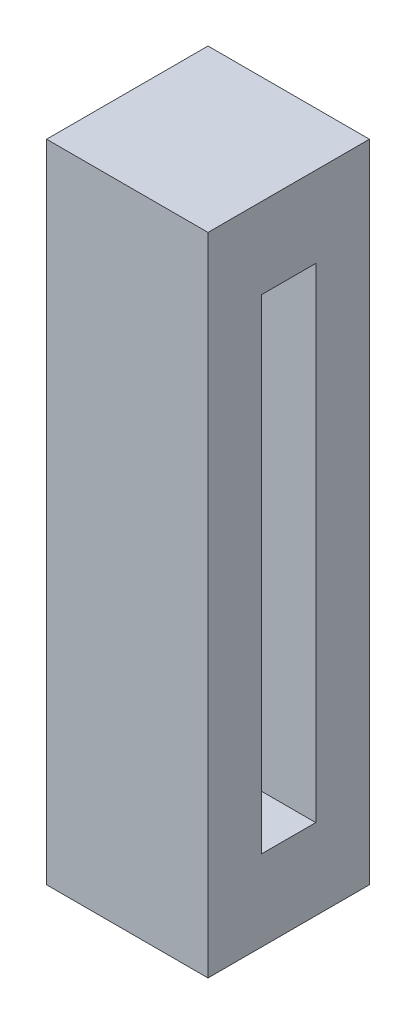
ISO-10303-21;
HEADER;
FILE_DESCRIPTION(('STEP AP214'),'2;1');
FILE_NAME('part.step','',(''),(''),'','','');
FILE_SCHEMA(('AUTOMOTIVE_DESIGN { 1 0 10303 214 1 1 1 1 }'));
ENDSEC;
DATA;
#1=APPLICATION_CONTEXT('core data for automotive mechanical design processes');
#2=APPLICATION_PROTOCOL_DEFINITION('international standard','automotive_design',2000,#1);
#3=PRODUCT_CONTEXT('',#1,'mechanical');
#4=PRODUCT('Part','Part','',(#3));
#5=PRODUCT_RELATED_PRODUCT_CATEGORY('part','',(#4));
#6=PRODUCT_DEFINITION_FORMATION('','',#4);
#7=PRODUCT_DEFINITION_CONTEXT('part definition',#1,'design');
#8=PRODUCT_DEFINITION('design','',#6,#7);
#9=PRODUCT_DEFINITION_SHAPE('','',#8);
#10=(LENGTH_UNIT() NAMED_UNIT(*) SI_UNIT(.MILLI.,.METRE.));
#11=(NAMED_UNIT(*) PLANE_ANGLE_UNIT() SI_UNIT($,.RADIAN.));
#12=(NAMED_UNIT(*) SI_UNIT($,.STERADIAN.) SOLID_ANGLE_UNIT());
#13=UNCERTAINTY_MEASURE_WITH_UNIT(LENGTH_MEASURE(1.E-05),#10,'distance_accuracy_value','');
#14=(GEOMETRIC_REPRESENTATION_CONTEXT(3) GLOBAL_UNCERTAINTY_ASSIGNED_CONTEXT((#13)) GLOBAL_UNIT_ASSIGNED_CONTEXT((#10,
#11,#12)) REPRESENTATION_CONTEXT('',''));
#15=CARTESIAN_POINT('',(0.,0.,0.));
#16=DIRECTION('',(0.,0.,1.));
#17=DIRECTION('',(1.,0.,0.));
#18=AXIS2_PLACEMENT_3D('',#15,#16,#17);
#19=CARTESIAN_POINT('',(1.,-4.,2.));
#20=DIRECTION('',(-1.,0.,0.));
#21=DIRECTION('',(0.,0.,1.));
#22=AXIS2_PLACEMENT_3D('',#19,#20,#21);
#23=PLANE('',#22);
#24=DIRECTION('',(0.,0.,1.));
#25=VECTOR('',#24,1.);
#26=CARTESIAN_POINT('',(1.,-3.,2.));
#27=LINE('',#26,#25);
#28=CARTESIAN_POINT('',(1.,-3.,0.665));
#29=VERTEX_POINT('',#28);
#30=CARTESIAN_POINT('',(1.,-3.,1.335));
#31=VERTEX_POINT('',#30);
#32=EDGE_CURVE('E138',#29,#31,#27,.T.);
#33=ORIENTED_EDGE('',*,*,#32,.T.);
#34=DIRECTION('',(0.,1.,0.));
#35=VECTOR('',#34,1.);
#36=CARTESIAN_POINT('',(1.,-4.,1.335));
#37=LINE('',#36,#35);
#38=CARTESIAN_POINT('',(1.,3.,1.335));
#39=VERTEX_POINT('',#38);
#40=EDGE_CURVE('E141',#31,#39,#37,.T.);
#41=ORIENTED_EDGE('',*,*,#40,.T.);
#42=DIRECTION('',(0.,0.,-1.));
#43=VECTOR('',#42,1.);
#44=CARTESIAN_POINT('',(1.,3.,2.));
#45=LINE('',#44,#43);
#46=CARTESIAN_POINT('',(1.,3.,0.665));
#47=VERTEX_POINT('',#46);
#48=EDGE_CURVE('E133',#39,#47,#45,.T.);
#49=ORIENTED_EDGE('',*,*,#48,.T.);
#50=DIRECTION('',(0.,-1.,0.));
#51=VECTOR('',#50,1.);
#52=CARTESIAN_POINT('',(1.,-4.,0.665));
#53=LINE('',#52,#51);
#54=EDGE_CURVE('E113',#47,#29,#53,.T.);
#55=ORIENTED_EDGE('',*,*,#54,.T.);
#56=EDGE_LOOP('',(#33,#41,#49,#55));
#57=FACE_BOUND('',#56,.T.);
#58=DIRECTION('',(0.,1.,0.));
#59=VECTOR('',#58,1.);
#60=CARTESIAN_POINT('',(1.,-4.,0.));
#61=LINE('',#60,#59);
#62=CARTESIAN_POINT('',(1.,-4.,0.));
#63=VERTEX_POINT('',#62);
#64=CARTESIAN_POINT('',(1.,4.,0.));
#65=VERTEX_POINT('',#64);
#66=EDGE_CURVE('E144',#63,#65,#61,.T.);
#67=ORIENTED_EDGE('',*,*,#66,.T.);
#68=DIRECTION('',(0.,0.,-1.));
#69=VECTOR('',#68,1.);
#70=CARTESIAN_POINT('',(1.,4.,2.));
#71=LINE('',#70,#69);
#72=CARTESIAN_POINT('',(1.,4.,2.));
#73=VERTEX_POINT('',#72);
#74=EDGE_CURVE('E11',#73,#65,#71,.T.);
#75=ORIENTED_EDGE('',*,*,#74,.F.);
#76=DIRECTION('',(0.,1.,0.));
#77=VECTOR('',#76,1.);
#78=CARTESIAN_POINT('',(1.,-4.,2.));
#79=LINE('',#78,#77);
#80=CARTESIAN_POINT('',(1.,-4.,2.));
#81=VERTEX_POINT('',#80);
#82=EDGE_CURVE('E145',#81,#73,#79,.T.);
#83=ORIENTED_EDGE('',*,*,#82,.F.);
#84=DIRECTION('',(0.,0.,-1.));
#85=VECTOR('',#84,1.);
#86=CARTESIAN_POINT('',(1.,-4.,2.));
#87=LINE('',#86,#85);
#88=EDGE_CURVE('E155',#81,#63,#87,.T.);
#89=ORIENTED_EDGE('',*,*,#88,.T.);
#90=EDGE_LOOP('',(#67,#75,#83,#89));
#91=FACE_BOUND('',#90,.T.);
#92=ADVANCED_FACE('F43',(#57,#91),#23,.F.);
#93=CARTESIAN_POINT('',(-1.,4.,2.));
#94=DIRECTION('',(0.,-1.,0.));
#95=DIRECTION('',(0.,0.,-1.));
#96=AXIS2_PLACEMENT_3D('',#93,#94,#95);
#97=PLANE('',#96);
#98=DIRECTION('',(-1.,0.,0.));
#99=VECTOR('',#98,1.);
#100=CARTESIAN_POINT('',(-1.,4.,0.));
#101=LINE('',#100,#99);
#102=CARTESIAN_POINT('',(-1.,4.,0.));
#103=VERTEX_POINT('',#102);
#104=EDGE_CURVE('E158',#65,#103,#101,.T.);
#105=ORIENTED_EDGE('',*,*,#104,.T.);
#106=DIRECTION('',(0.,0.,-1.));
#107=VECTOR('',#106,1.);
#108=CARTESIAN_POINT('',(-1.,4.,2.));
#109=LINE('',#108,#107);
#110=CARTESIAN_POINT('',(-1.,4.,2.));
#111=VERTEX_POINT('',#110);
#112=EDGE_CURVE('E50',#111,#103,#109,.T.);
#113=ORIENTED_EDGE('',*,*,#112,.F.);
#114=DIRECTION('',(-1.,0.,0.));
#115=VECTOR('',#114,1.);
#116=CARTESIAN_POINT('',(-1.,4.,2.));
#117=LINE('',#116,#115);
#118=EDGE_CURVE('E148',#73,#111,#117,.T.);
#119=ORIENTED_EDGE('',*,*,#118,.F.);
#120=ORIENTED_EDGE('',*,*,#74,.T.);
#121=EDGE_LOOP('',(#105,#113,#119,#120));
#122=FACE_BOUND('',#121,.T.);
#123=ADVANCED_FACE('F186',(#122),#97,.F.);
#124=CARTESIAN_POINT('',(-1.,-4.,2.));
#125=DIRECTION('',(1.,0.,0.));
#126=DIRECTION('',(0.,0.,-1.));
#127=AXIS2_PLACEMENT_3D('',#124,#125,#126);
#128=PLANE('',#127);
#129=DIRECTION('',(0.,0.,-1.));
#130=VECTOR('',#129,1.);
#131=CARTESIAN_POINT('',(-1.,3.,0.665));
#132=LINE('',#131,#130);
#133=CARTESIAN_POINT('',(-1.,3.,1.335));
#134=VERTEX_POINT('',#133);
#135=CARTESIAN_POINT('',(-1.,3.,0.665));
#136=VERTEX_POINT('',#135);
#137=EDGE_CURVE('E119',#134,#136,#132,.T.);
#138=ORIENTED_EDGE('',*,*,#137,.F.);
#139=DIRECTION('',(0.,1.,0.));
#140=VECTOR('',#139,1.);
#141=CARTESIAN_POINT('',(-1.,-3.,1.335));
#142=LINE('',#141,#140);
#143=CARTESIAN_POINT('',(-1.,-3.,1.335));
#144=VERTEX_POINT('',#143);
#145=EDGE_CURVE('E65',#144,#134,#142,.T.);
#146=ORIENTED_EDGE('',*,*,#145,.F.);
#147=DIRECTION('',(0.,0.,1.));
#148=VECTOR('',#147,1.);
#149=CARTESIAN_POINT('',(-1.,-3.,0.665));
#150=LINE('',#149,#148);
#151=CARTESIAN_POINT('',(-1.,-3.,0.665));
#152=VERTEX_POINT('',#151);
#153=EDGE_CURVE('E126',#152,#144,#150,.T.);
#154=ORIENTED_EDGE('',*,*,#153,.F.);
#155=DIRECTION('',(0.,-1.,0.));
#156=VECTOR('',#155,1.);
#157=CARTESIAN_POINT('',(-1.,-3.,0.665));
#158=LINE('',#157,#156);
#159=EDGE_CURVE('E110',#136,#152,#158,.T.);
#160=ORIENTED_EDGE('',*,*,#159,.F.);
#161=EDGE_LOOP('',(#138,#146,#154,#160));
#162=FACE_BOUND('',#161,.T.);
#163=DIRECTION('',(0.,-1.,0.));
#164=VECTOR('',#163,1.);
#165=CARTESIAN_POINT('',(-1.,-4.,0.));
#166=LINE('',#165,#164);
#167=CARTESIAN_POINT('',(-1.,-4.,0.));
#168=VERTEX_POINT('',#167);
#169=EDGE_CURVE('E160',#103,#168,#166,.T.);
#170=ORIENTED_EDGE('',*,*,#169,.T.);
#171=DIRECTION('',(0.,0.,-1.));
#172=VECTOR('',#171,1.);
#173=CARTESIAN_POINT('',(-1.,-4.,2.));
#174=LINE('',#173,#172);
#175=CARTESIAN_POINT('',(-1.,-4.,2.));
#176=VERTEX_POINT('',#175);
#177=EDGE_CURVE('E165',#176,#168,#174,.T.);
#178=ORIENTED_EDGE('',*,*,#177,.F.);
#179=DIRECTION('',(0.,-1.,0.));
#180=VECTOR('',#179,1.);
#181=CARTESIAN_POINT('',(-1.,-4.,2.));
#182=LINE('',#181,#180);
#183=EDGE_CURVE('E151',#111,#176,#182,.T.);
#184=ORIENTED_EDGE('',*,*,#183,.F.);
#185=ORIENTED_EDGE('',*,*,#112,.T.);
#186=EDGE_LOOP('',(#170,#178,#184,#185));
#187=FACE_BOUND('',#186,.T.);
#188=ADVANCED_FACE('F123',(#162,#187),#128,.F.);
#189=CARTESIAN_POINT('',(-1.,-4.,2.));
#190=DIRECTION('',(0.,1.,0.));
#191=DIRECTION('',(0.,0.,1.));
#192=AXIS2_PLACEMENT_3D('',#189,#190,#191);
#193=PLANE('',#192);
#194=DIRECTION('',(1.,0.,0.));
#195=VECTOR('',#194,1.);
#196=CARTESIAN_POINT('',(-1.,-4.,0.));
#197=LINE('',#196,#195);
#198=EDGE_CURVE('E149',#168,#63,#197,.T.);
#199=ORIENTED_EDGE('',*,*,#198,.T.);
#200=ORIENTED_EDGE('',*,*,#88,.F.);
#201=DIRECTION('',(1.,0.,0.));
#202=VECTOR('',#201,1.);
#203=CARTESIAN_POINT('',(-1.,-4.,2.));
#204=LINE('',#203,#202);
#205=EDGE_CURVE('E153',#176,#81,#204,.T.);
#206=ORIENTED_EDGE('',*,*,#205,.F.);
#207=ORIENTED_EDGE('',*,*,#177,.T.);
#208=EDGE_LOOP('',(#199,#200,#206,#207));
#209=FACE_BOUND('',#208,.T.);
#210=ADVANCED_FACE('F179',(#209),#193,.F.);
#211=CARTESIAN_POINT('',(0.,0.,2.));
#212=DIRECTION('',(0.,0.,-1.));
#213=DIRECTION('',(-1.,0.,0.));
#214=AXIS2_PLACEMENT_3D('',#211,#212,#213);
#215=PLANE('',#214);
#216=ORIENTED_EDGE('',*,*,#82,.T.);
#217=ORIENTED_EDGE('',*,*,#118,.T.);
#218=ORIENTED_EDGE('',*,*,#183,.T.);
#219=ORIENTED_EDGE('',*,*,#205,.T.);
#220=EDGE_LOOP('',(#216,#217,#218,#219));
#221=FACE_BOUND('',#220,.T.);
#222=ADVANCED_FACE('F185',(#221),#215,.F.);
#223=CARTESIAN_POINT('',(0.,0.,0.));
#224=DIRECTION('',(0.,0.,-1.));
#225=DIRECTION('',(-1.,0.,0.));
#226=AXIS2_PLACEMENT_3D('',#223,#224,#225);
#227=PLANE('',#226);
#228=ORIENTED_EDGE('',*,*,#66,.F.);
#229=ORIENTED_EDGE('',*,*,#198,.F.);
#230=ORIENTED_EDGE('',*,*,#169,.F.);
#231=ORIENTED_EDGE('',*,*,#104,.F.);
#232=EDGE_LOOP('',(#228,#229,#230,#231));
#233=FACE_BOUND('',#232,.T.);
#234=ADVANCED_FACE('F176',(#233),#227,.T.);
#235=CARTESIAN_POINT('',(2.,-3.,1.335));
#236=DIRECTION('',(0.,0.,1.));
#237=DIRECTION('',(1.,0.,0.));
#238=AXIS2_PLACEMENT_3D('',#235,#236,#237);
#239=PLANE('',#238);
#240=DIRECTION('',(-1.,0.,0.));
#241=VECTOR('',#240,1.);
#242=CARTESIAN_POINT('',(2.,-3.,1.335));
#243=LINE('',#242,#241);
#244=EDGE_CURVE('E131',#31,#144,#243,.T.);
#245=ORIENTED_EDGE('',*,*,#244,.T.);
#246=ORIENTED_EDGE('',*,*,#145,.T.);
#247=DIRECTION('',(-1.,0.,0.));
#248=VECTOR('',#247,1.);
#249=CARTESIAN_POINT('',(2.,3.,1.335));
#250=LINE('',#249,#248);
#251=EDGE_CURVE('E116',#39,#134,#250,.T.);
#252=ORIENTED_EDGE('',*,*,#251,.F.);
#253=ORIENTED_EDGE('',*,*,#40,.F.);
#254=EDGE_LOOP('',(#245,#246,#252,#253));
#255=FACE_BOUND('',#254,.T.);
#256=ADVANCED_FACE('F199',(#255),#239,.F.);
#257=CARTESIAN_POINT('',(2.,-3.,0.665));
#258=DIRECTION('',(0.,-1.,0.));
#259=DIRECTION('',(0.,0.,-1.));
#260=AXIS2_PLACEMENT_3D('',#257,#258,#259);
#261=PLANE('',#260);
#262=DIRECTION('',(-1.,0.,0.));
#263=VECTOR('',#262,1.);
#264=CARTESIAN_POINT('',(2.,-3.,0.665));
#265=LINE('',#264,#263);
#266=EDGE_CURVE('E115',#29,#152,#265,.T.);
#267=ORIENTED_EDGE('',*,*,#266,.T.);
#268=ORIENTED_EDGE('',*,*,#153,.T.);
#269=ORIENTED_EDGE('',*,*,#244,.F.);
#270=ORIENTED_EDGE('',*,*,#32,.F.);
#271=EDGE_LOOP('',(#267,#268,#269,#270));
#272=FACE_BOUND('',#271,.T.);
#273=ADVANCED_FACE('F204',(#272),#261,.F.);
#274=CARTESIAN_POINT('',(2.,-3.,0.665));
#275=DIRECTION('',(0.,0.,-1.));
#276=DIRECTION('',(-1.,0.,0.));
#277=AXIS2_PLACEMENT_3D('',#274,#275,#276);
#278=PLANE('',#277);
#279=DIRECTION('',(-1.,0.,0.));
#280=VECTOR('',#279,1.);
#281=CARTESIAN_POINT('',(2.,3.,0.665));
#282=LINE('',#281,#280);
#283=EDGE_CURVE('E57',#47,#136,#282,.T.);
#284=ORIENTED_EDGE('',*,*,#283,.T.);
#285=ORIENTED_EDGE('',*,*,#159,.T.);
#286=ORIENTED_EDGE('',*,*,#266,.F.);
#287=ORIENTED_EDGE('',*,*,#54,.F.);
#288=EDGE_LOOP('',(#284,#285,#286,#287));
#289=FACE_BOUND('',#288,.T.);
#290=ADVANCED_FACE('F107',(#289),#278,.F.);
#291=CARTESIAN_POINT('',(2.,3.,0.665));
#292=DIRECTION('',(0.,1.,0.));
#293=DIRECTION('',(0.,0.,1.));
#294=AXIS2_PLACEMENT_3D('',#291,#292,#293);
#295=PLANE('',#294);
#296=ORIENTED_EDGE('',*,*,#251,.T.);
#297=ORIENTED_EDGE('',*,*,#137,.T.);
#298=ORIENTED_EDGE('',*,*,#283,.F.);
#299=ORIENTED_EDGE('',*,*,#48,.F.);
#300=EDGE_LOOP('',(#296,#297,#298,#299));
#301=FACE_BOUND('',#300,.T.);
#302=ADVANCED_FACE('F120',(#301),#295,.F.);
#303=CLOSED_SHELL('',(#92,#123,#188,#210,#222,#234,#256,#273,#290,#302));
#304=MANIFOLD_SOLID_BREP('B2',#303);
#305=ADVANCED_BREP_SHAPE_REPRESENTATION('',(#18,#304),#14);
#306=SHAPE_DEFINITION_REPRESENTATION(#9,#305);
ENDSEC;
END-ISO-10303-21;
